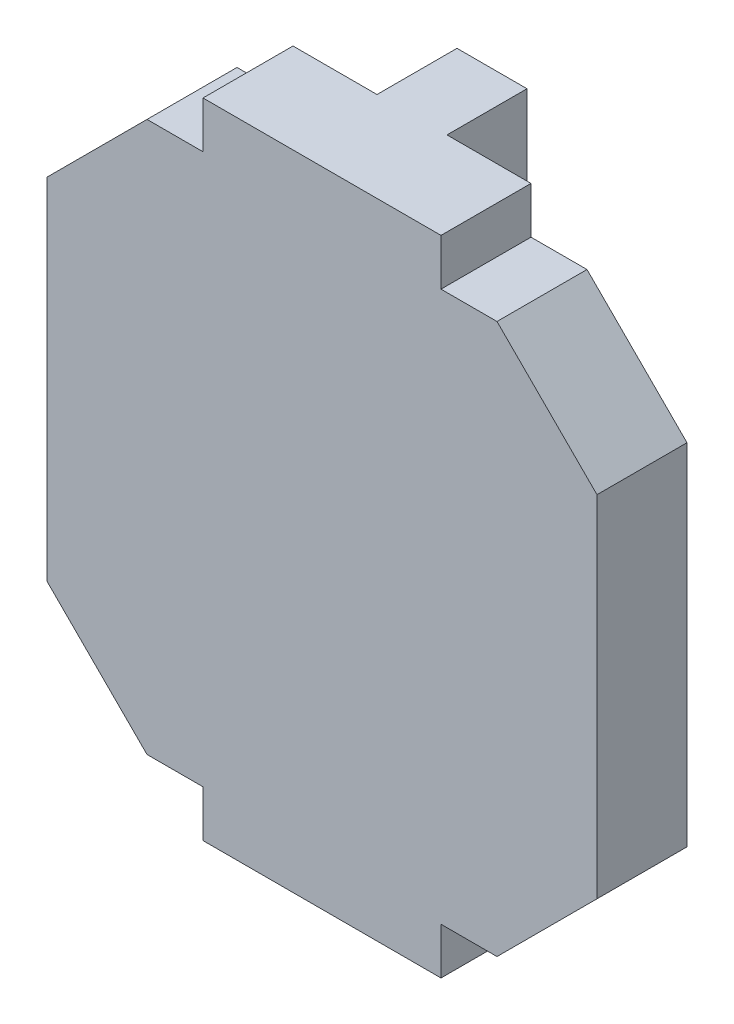
ISO-10303-21;
HEADER;
FILE_DESCRIPTION(('STEP AP214'),'2;1');
FILE_NAME('part.step','',(''),(''),'','','');
FILE_SCHEMA(('AUTOMOTIVE_DESIGN { 1 0 10303 214 1 1 1 1 }'));
ENDSEC;
DATA;
#1=APPLICATION_CONTEXT('core data for automotive mechanical design processes');
#2=APPLICATION_PROTOCOL_DEFINITION('international standard','automotive_design',2000,#1);
#3=PRODUCT_CONTEXT('',#1,'mechanical');
#4=PRODUCT('Part','Part','',(#3));
#5=PRODUCT_RELATED_PRODUCT_CATEGORY('part','',(#4));
#6=PRODUCT_DEFINITION_FORMATION('','',#4);
#7=PRODUCT_DEFINITION_CONTEXT('part definition',#1,'design');
#8=PRODUCT_DEFINITION('design','',#6,#7);
#9=PRODUCT_DEFINITION_SHAPE('','',#8);
#10=(LENGTH_UNIT() NAMED_UNIT(*) SI_UNIT(.MILLI.,.METRE.));
#11=(NAMED_UNIT(*) PLANE_ANGLE_UNIT() SI_UNIT($,.RADIAN.));
#12=(NAMED_UNIT(*) SI_UNIT($,.STERADIAN.) SOLID_ANGLE_UNIT());
#13=UNCERTAINTY_MEASURE_WITH_UNIT(LENGTH_MEASURE(1.E-05),#10,'distance_accuracy_value','');
#14=(GEOMETRIC_REPRESENTATION_CONTEXT(3) GLOBAL_UNCERTAINTY_ASSIGNED_CONTEXT((#13)) GLOBAL_UNIT_ASSIGNED_CONTEXT((#10,
#11,#12)) REPRESENTATION_CONTEXT('',''));
#15=CARTESIAN_POINT('',(0.,0.,0.));
#16=DIRECTION('',(0.,0.,1.));
#17=DIRECTION('',(1.,0.,0.));
#18=AXIS2_PLACEMENT_3D('',#15,#16,#17);
#19=CARTESIAN_POINT('',(0.,0.,0.));
#20=DIRECTION('',(0.,0.,1.));
#21=DIRECTION('',(1.,0.,0.));
#22=AXIS2_PLACEMENT_3D('',#19,#20,#21);
#23=PLANE('',#22);
#24=DIRECTION('',(-1.35982156307027E-09,1.,0.));
#25=VECTOR('',#24,1.);
#26=CARTESIAN_POINT('',(44.1324997194762,66.7580497292959,0.));
#27=LINE('',#26,#25);
#28=CARTESIAN_POINT('',(44.1324997177492,68.0280497292959,0.));
#29=VERTEX_POINT('',#28);
#30=CARTESIAN_POINT('',(44.1324997117048,72.4730496370595,0.));
#31=VERTEX_POINT('',#30);
#32=EDGE_CURVE('E268',#29,#31,#27,.T.);
#33=ORIENTED_EDGE('',*,*,#32,.F.);
#34=DIRECTION('',(0.707106780225013,0.707106782148082,0.));
#35=VECTOR('',#34,1.);
#36=CARTESIAN_POINT('',(44.1324997177492,68.0280497292959,0.));
#37=LINE('',#36,#35);
#38=CARTESIAN_POINT('',(42.8624997194762,66.7580497275689,0.));
#39=VERTEX_POINT('',#38);
#40=EDGE_CURVE('E53',#29,#39,#37,.F.);
#41=ORIENTED_EDGE('',*,*,#40,.T.);
#42=DIRECTION('',(1.,1.35982290130013E-09,0.));
#43=VECTOR('',#42,1.);
#44=CARTESIAN_POINT('',(42.1512997655944,66.7580497266018,0.));
#45=LINE('',#44,#43);
#46=CARTESIAN_POINT('',(42.1512997655944,66.7580497266018,0.));
#47=VERTEX_POINT('',#46);
#48=EDGE_CURVE('E266',#47,#39,#45,.T.);
#49=ORIENTED_EDGE('',*,*,#48,.F.);
#50=DIRECTION('',(-1.35982309308189E-09,1.,0.));
#51=VECTOR('',#50,1.);
#52=CARTESIAN_POINT('',(42.1512997663986,66.1666514845272,0.));
#53=LINE('',#52,#51);
#54=CARTESIAN_POINT('',(42.1512997663986,66.1666514845272,0.));
#55=VERTEX_POINT('',#54);
#56=EDGE_CURVE('E263',#55,#47,#53,.T.);
#57=ORIENTED_EDGE('',*,*,#56,.F.);
#58=DIRECTION('',(1.,1.35982210442275E-09,0.));
#59=VECTOR('',#58,1.);
#60=CARTESIAN_POINT('',(39.1286997663986,66.166651480417,0.));
#61=LINE('',#60,#59);
#62=CARTESIAN_POINT('',(41.0844997551882,66.1666514830765,0.));
#63=VERTEX_POINT('',#62);
#64=EDGE_CURVE('E259',#63,#55,#61,.T.);
#65=ORIENTED_EDGE('',*,*,#64,.F.);
#66=DIRECTION('',(0.,-1.,0.));
#67=VECTOR('',#66,1.);
#68=CARTESIAN_POINT('',(41.0844997551882,66.0904514817813,0.));
#69=LINE('',#68,#67);
#70=CARTESIAN_POINT('',(41.0844997551882,74.3344478749894,0.));
#71=VERTEX_POINT('',#70);
#72=EDGE_CURVE('E214',#71,#63,#69,.T.);
#73=ORIENTED_EDGE('',*,*,#72,.F.);
#74=DIRECTION('',(-1.,-1.35982210442275E-09,0.));
#75=VECTOR('',#74,1.);
#76=CARTESIAN_POINT('',(42.1512997552919,74.3344478764401,0.));
#77=LINE('',#76,#75);
#78=CARTESIAN_POINT('',(42.1512997552919,74.3344478764401,0.));
#79=VERTEX_POINT('',#78);
#80=EDGE_CURVE('E276',#79,#71,#77,.T.);
#81=ORIENTED_EDGE('',*,*,#80,.F.);
#82=DIRECTION('',(-1.35982309308183E-09,1.,0.));
#83=VECTOR('',#82,1.);
#84=CARTESIAN_POINT('',(42.1512997560961,73.7430496343654,0.));
#85=LINE('',#84,#83);
#86=CARTESIAN_POINT('',(42.1512997560961,73.7430496343654,0.));
#87=VERTEX_POINT('',#86);
#88=EDGE_CURVE('E273',#87,#79,#85,.T.);
#89=ORIENTED_EDGE('',*,*,#88,.F.);
#90=DIRECTION('',(-1.,-1.35982290130013E-09,0.));
#91=VECTOR('',#90,1.);
#92=CARTESIAN_POINT('',(44.1324997099778,73.7430496370595,0.));
#93=LINE('',#92,#91);
#94=CARTESIAN_POINT('',(42.8624997099778,73.7430496353325,0.));
#95=VERTEX_POINT('',#94);
#96=EDGE_CURVE('E271',#95,#87,#93,.T.);
#97=ORIENTED_EDGE('',*,*,#96,.F.);
#98=DIRECTION('',(-0.707106782148084,0.707106780225011,0.));
#99=VECTOR('',#98,1.);
#100=CARTESIAN_POINT('',(42.8624997099778,73.7430496353325,0.));
#101=LINE('',#100,#99);
#102=EDGE_CURVE('E61',#95,#31,#101,.F.);
#103=ORIENTED_EDGE('',*,*,#102,.T.);
#104=EDGE_LOOP('',(#33,#41,#49,#57,#65,#73,#81,#89,#97,#103));
#105=FACE_BOUND('',#104,.T.);
#106=ADVANCED_FACE('F37',(#105),#23,.F.);
#107=DIRECTION('',(1.,1.35982290130013E-09,0.));
#108=VECTOR('',#107,1.);
#109=CARTESIAN_POINT('',(37.1474998117126,66.7580497197976,0.));
#110=LINE('',#109,#108);
#111=CARTESIAN_POINT('',(38.4174998117126,66.7580497215245,0.));
#112=VERTEX_POINT('',#111);
#113=CARTESIAN_POINT('',(39.1286997655944,66.7580497224916,0.));
#114=VERTEX_POINT('',#113);
#115=EDGE_CURVE('E210',#112,#114,#110,.T.);
#116=ORIENTED_EDGE('',*,*,#115,.F.);
#117=DIRECTION('',(0.707106782148082,-0.707106780225013,0.));
#118=VECTOR('',#117,1.);
#119=CARTESIAN_POINT('',(38.4174998117126,66.7580497215245,0.));
#120=LINE('',#119,#118);
#121=CARTESIAN_POINT('',(37.1474998099856,68.0280497197976,0.));
#122=VERTEX_POINT('',#121);
#123=EDGE_CURVE('E310',#112,#122,#120,.F.);
#124=ORIENTED_EDGE('',*,*,#123,.T.);
#125=DIRECTION('',(1.35982156307027E-09,-1.,0.));
#126=VECTOR('',#125,1.);
#127=CARTESIAN_POINT('',(37.1474998022143,73.7430496275611,0.));
#128=LINE('',#127,#126);
#129=CARTESIAN_POINT('',(37.1474998039412,72.4730496275611,0.));
#130=VERTEX_POINT('',#129);
#131=EDGE_CURVE('E207',#130,#122,#128,.T.);
#132=ORIENTED_EDGE('',*,*,#131,.F.);
#133=DIRECTION('',(-0.707106780225013,-0.707106782148082,0.));
#134=VECTOR('',#133,1.);
#135=CARTESIAN_POINT('',(37.1474998039412,72.4730496275611,0.));
#136=LINE('',#135,#134);
#137=CARTESIAN_POINT('',(38.4174998022143,73.7430496292881,0.));
#138=VERTEX_POINT('',#137);
#139=EDGE_CURVE('E308',#130,#138,#136,.F.);
#140=ORIENTED_EDGE('',*,*,#139,.T.);
#141=DIRECTION('',(-1.,-1.35982290130013E-09,0.));
#142=VECTOR('',#141,1.);
#143=CARTESIAN_POINT('',(39.128699756096,73.7430496302552,0.));
#144=LINE('',#143,#142);
#145=CARTESIAN_POINT('',(39.128699756096,73.7430496302552,0.));
#146=VERTEX_POINT('',#145);
#147=EDGE_CURVE('E230',#146,#138,#144,.T.);
#148=ORIENTED_EDGE('',*,*,#147,.F.);
#149=DIRECTION('',(1.35982309308186E-09,-1.,0.));
#150=VECTOR('',#149,1.);
#151=CARTESIAN_POINT('',(39.1286997552919,74.3344478723299,0.));
#152=LINE('',#151,#150);
#153=CARTESIAN_POINT('',(39.1286997552919,74.3344478723299,0.));
#154=VERTEX_POINT('',#153);
#155=EDGE_CURVE('E278',#154,#146,#152,.T.);
#156=ORIENTED_EDGE('',*,*,#155,.F.);
#157=CARTESIAN_POINT('',(40.1954997551882,74.3344478764401,0.));
#158=VERTEX_POINT('',#157);
#159=EDGE_CURVE('E275',#158,#154,#77,.T.);
#160=ORIENTED_EDGE('',*,*,#159,.F.);
#161=DIRECTION('',(0.,1.,0.));
#162=VECTOR('',#161,1.);
#163=CARTESIAN_POINT('',(40.1954997551882,66.0904514817813,0.));
#164=LINE('',#163,#162);
#165=CARTESIAN_POINT('',(40.1954997551882,66.1666514818676,0.));
#166=VERTEX_POINT('',#165);
#167=EDGE_CURVE('E189',#166,#158,#164,.T.);
#168=ORIENTED_EDGE('',*,*,#167,.F.);
#169=CARTESIAN_POINT('',(39.1286997663986,66.166651480417,0.));
#170=VERTEX_POINT('',#169);
#171=EDGE_CURVE('E260',#170,#166,#61,.T.);
#172=ORIENTED_EDGE('',*,*,#171,.F.);
#173=DIRECTION('',(1.35982309308186E-09,-1.,0.));
#174=VECTOR('',#173,1.);
#175=CARTESIAN_POINT('',(39.1286997655944,66.7580497224916,0.));
#176=LINE('',#175,#174);
#177=EDGE_CURVE('E257',#114,#170,#176,.T.);
#178=ORIENTED_EDGE('',*,*,#177,.F.);
#179=EDGE_LOOP('',(#116,#124,#132,#140,#148,#156,#160,#168,#172,#178));
#180=FACE_BOUND('',#179,.T.);
#181=ADVANCED_FACE('F397',(#180),#23,.F.);
#182=CARTESIAN_POINT('',(37.1474998022143,73.7430496275611,1.143));
#183=DIRECTION('',(1.,1.35982156307027E-09,0.));
#184=DIRECTION('',(-1.35982156307027E-09,1.,0.));
#185=AXIS2_PLACEMENT_3D('',#182,#183,#184);
#186=PLANE('',#185);
#187=ORIENTED_EDGE('',*,*,#131,.T.);
#188=DIRECTION('',(0.,0.,1.));
#189=VECTOR('',#188,1.);
#190=CARTESIAN_POINT('',(37.1474998099856,68.0280497197976,1.143));
#191=LINE('',#190,#189);
#192=CARTESIAN_POINT('',(37.1474998099856,68.0280497197976,1.143));
#193=VERTEX_POINT('',#192);
#194=EDGE_CURVE('E315',#122,#193,#191,.T.);
#195=ORIENTED_EDGE('',*,*,#194,.T.);
#196=DIRECTION('',(1.35982156307027E-09,-1.,0.));
#197=VECTOR('',#196,1.);
#198=CARTESIAN_POINT('',(37.1474998022143,73.7430496275611,1.143));
#199=LINE('',#198,#197);
#200=CARTESIAN_POINT('',(37.1474998039412,72.4730496275611,1.143));
#201=VERTEX_POINT('',#200);
#202=EDGE_CURVE('E226',#201,#193,#199,.T.);
#203=ORIENTED_EDGE('',*,*,#202,.F.);
#204=DIRECTION('',(0.,0.,-1.));
#205=VECTOR('',#204,1.);
#206=CARTESIAN_POINT('',(37.1474998039412,72.4730496275611,1.143));
#207=LINE('',#206,#205);
#208=EDGE_CURVE('E312',#201,#130,#207,.T.);
#209=ORIENTED_EDGE('',*,*,#208,.T.);
#210=EDGE_LOOP('',(#187,#195,#203,#209));
#211=FACE_BOUND('',#210,.T.);
#212=ADVANCED_FACE('F402',(#211),#186,.F.);
#213=CARTESIAN_POINT('',(37.1474998117126,66.7580497197976,1.143));
#214=DIRECTION('',(-1.35982290130013E-09,1.,0.));
#215=DIRECTION('',(-1.,-1.35982290130013E-09,0.));
#216=AXIS2_PLACEMENT_3D('',#213,#214,#215);
#217=PLANE('',#216);
#218=DIRECTION('',(1.,1.35982290130013E-09,0.));
#219=VECTOR('',#218,1.);
#220=CARTESIAN_POINT('',(37.1474998117126,66.7580497197976,1.143));
#221=LINE('',#220,#219);
#222=CARTESIAN_POINT('',(38.4174998117126,66.7580497215245,1.143));
#223=VERTEX_POINT('',#222);
#224=CARTESIAN_POINT('',(39.1286997655944,66.7580497224916,1.143));
#225=VERTEX_POINT('',#224);
#226=EDGE_CURVE('E229',#223,#225,#221,.T.);
#227=ORIENTED_EDGE('',*,*,#226,.F.);
#228=DIRECTION('',(0.,0.,-1.));
#229=VECTOR('',#228,1.);
#230=CARTESIAN_POINT('',(38.4174998117126,66.7580497215245,1.143));
#231=LINE('',#230,#229);
#232=EDGE_CURVE('E305',#223,#112,#231,.T.);
#233=ORIENTED_EDGE('',*,*,#232,.T.);
#234=ORIENTED_EDGE('',*,*,#115,.T.);
#235=DIRECTION('',(0.,0.,-1.));
#236=VECTOR('',#235,1.);
#237=CARTESIAN_POINT('',(39.1286997655944,66.7580497224916,1.143));
#238=LINE('',#237,#236);
#239=EDGE_CURVE('E302',#225,#114,#238,.T.);
#240=ORIENTED_EDGE('',*,*,#239,.F.);
#241=EDGE_LOOP('',(#227,#233,#234,#240));
#242=FACE_BOUND('',#241,.T.);
#243=ADVANCED_FACE('F432',(#242),#217,.F.);
#244=CARTESIAN_POINT('',(39.1286997655944,66.7580497224916,1.143));
#245=DIRECTION('',(1.,1.35982309308186E-09,0.));
#246=DIRECTION('',(-1.35982309308186E-09,1.,0.));
#247=AXIS2_PLACEMENT_3D('',#244,#245,#246);
#248=PLANE('',#247);
#249=ORIENTED_EDGE('',*,*,#177,.T.);
#250=DIRECTION('',(0.,0.,-1.));
#251=VECTOR('',#250,1.);
#252=CARTESIAN_POINT('',(39.1286997663986,66.166651480417,1.143));
#253=LINE('',#252,#251);
#254=CARTESIAN_POINT('',(39.1286997663986,66.166651480417,1.143));
#255=VERTEX_POINT('',#254);
#256=EDGE_CURVE('E299',#255,#170,#253,.T.);
#257=ORIENTED_EDGE('',*,*,#256,.F.);
#258=DIRECTION('',(1.35982309308186E-09,-1.,0.));
#259=VECTOR('',#258,1.);
#260=CARTESIAN_POINT('',(39.1286997655944,66.7580497224916,1.143));
#261=LINE('',#260,#259);
#262=EDGE_CURVE('E232',#225,#255,#261,.T.);
#263=ORIENTED_EDGE('',*,*,#262,.F.);
#264=ORIENTED_EDGE('',*,*,#239,.T.);
#265=EDGE_LOOP('',(#249,#257,#263,#264));
#266=FACE_BOUND('',#265,.T.);
#267=ADVANCED_FACE('F429',(#266),#248,.F.);
#268=CARTESIAN_POINT('',(39.1286997663986,66.166651480417,1.143));
#269=DIRECTION('',(-1.35982210442275E-09,1.,0.));
#270=DIRECTION('',(-1.,-1.35982210442275E-09,0.));
#271=AXIS2_PLACEMENT_3D('',#268,#269,#270);
#272=PLANE('',#271);
#273=ORIENTED_EDGE('',*,*,#171,.T.);
#274=EDGE_CURVE('E264',#166,#63,#61,.T.);
#275=ORIENTED_EDGE('',*,*,#274,.T.);
#276=ORIENTED_EDGE('',*,*,#64,.T.);
#277=DIRECTION('',(0.,0.,-1.));
#278=VECTOR('',#277,1.);
#279=CARTESIAN_POINT('',(42.1512997663986,66.1666514845272,1.143));
#280=LINE('',#279,#278);
#281=CARTESIAN_POINT('',(42.1512997663986,66.1666514845272,1.143));
#282=VERTEX_POINT('',#281);
#283=EDGE_CURVE('E296',#282,#55,#280,.T.);
#284=ORIENTED_EDGE('',*,*,#283,.F.);
#285=DIRECTION('',(1.,1.35982210442275E-09,0.));
#286=VECTOR('',#285,1.);
#287=CARTESIAN_POINT('',(39.1286997663986,66.166651480417,1.143));
#288=LINE('',#287,#286);
#289=EDGE_CURVE('E234',#255,#282,#288,.T.);
#290=ORIENTED_EDGE('',*,*,#289,.F.);
#291=ORIENTED_EDGE('',*,*,#256,.T.);
#292=EDGE_LOOP('',(#273,#275,#276,#284,#290,#291));
#293=FACE_BOUND('',#292,.T.);
#294=ADVANCED_FACE('F375',(#293),#272,.F.);
#295=CARTESIAN_POINT('',(42.1512997663986,66.1666514845272,1.143));
#296=DIRECTION('',(-1.,-1.35982309308189E-09,0.));
#297=DIRECTION('',(1.35982309308189E-09,-1.,0.));
#298=AXIS2_PLACEMENT_3D('',#295,#296,#297);
#299=PLANE('',#298);
#300=ORIENTED_EDGE('',*,*,#56,.T.);
#301=DIRECTION('',(0.,0.,-1.));
#302=VECTOR('',#301,1.);
#303=CARTESIAN_POINT('',(42.1512997655944,66.7580497266018,1.143));
#304=LINE('',#303,#302);
#305=CARTESIAN_POINT('',(42.1512997655944,66.7580497266018,1.143));
#306=VERTEX_POINT('',#305);
#307=EDGE_CURVE('E293',#306,#47,#304,.T.);
#308=ORIENTED_EDGE('',*,*,#307,.F.);
#309=DIRECTION('',(-1.35982309308189E-09,1.,0.));
#310=VECTOR('',#309,1.);
#311=CARTESIAN_POINT('',(42.1512997663986,66.1666514845272,1.143));
#312=LINE('',#311,#310);
#313=EDGE_CURVE('E236',#282,#306,#312,.T.);
#314=ORIENTED_EDGE('',*,*,#313,.F.);
#315=ORIENTED_EDGE('',*,*,#283,.T.);
#316=EDGE_LOOP('',(#300,#308,#314,#315));
#317=FACE_BOUND('',#316,.T.);
#318=ADVANCED_FACE('F368',(#317),#299,.F.);
#319=CARTESIAN_POINT('',(42.1512997655944,66.7580497266018,1.143));
#320=DIRECTION('',(-1.35982290130013E-09,1.,0.));
#321=DIRECTION('',(-1.,-1.35982290130013E-09,0.));
#322=AXIS2_PLACEMENT_3D('',#319,#320,#321);
#323=PLANE('',#322);
#324=ORIENTED_EDGE('',*,*,#48,.T.);
#325=DIRECTION('',(0.,0.,1.));
#326=VECTOR('',#325,1.);
#327=CARTESIAN_POINT('',(42.8624997194762,66.7580497275689,1.143));
#328=LINE('',#327,#326);
#329=CARTESIAN_POINT('',(42.8624997194762,66.7580497275689,1.143));
#330=VERTEX_POINT('',#329);
#331=EDGE_CURVE('E332',#39,#330,#328,.T.);
#332=ORIENTED_EDGE('',*,*,#331,.T.);
#333=DIRECTION('',(1.,1.35982290130013E-09,0.));
#334=VECTOR('',#333,1.);
#335=CARTESIAN_POINT('',(42.1512997655944,66.7580497266018,1.143));
#336=LINE('',#335,#334);
#337=EDGE_CURVE('E238',#306,#330,#336,.T.);
#338=ORIENTED_EDGE('',*,*,#337,.F.);
#339=ORIENTED_EDGE('',*,*,#307,.T.);
#340=EDGE_LOOP('',(#324,#332,#338,#339));
#341=FACE_BOUND('',#340,.T.);
#342=ADVANCED_FACE('F362',(#341),#323,.F.);
#343=CARTESIAN_POINT('',(44.1324997194762,66.7580497292959,1.143));
#344=DIRECTION('',(-1.,-1.35982156307027E-09,0.));
#345=DIRECTION('',(1.35982156307027E-09,-1.,0.));
#346=AXIS2_PLACEMENT_3D('',#343,#344,#345);
#347=PLANE('',#346);
#348=DIRECTION('',(-1.35982156307027E-09,1.,0.));
#349=VECTOR('',#348,1.);
#350=CARTESIAN_POINT('',(44.1324997194762,66.7580497292959,1.143));
#351=LINE('',#350,#349);
#352=CARTESIAN_POINT('',(44.1324997177492,68.0280497292959,1.143));
#353=VERTEX_POINT('',#352);
#354=CARTESIAN_POINT('',(44.1324997117048,72.4730496370595,1.143));
#355=VERTEX_POINT('',#354);
#356=EDGE_CURVE('E241',#353,#355,#351,.T.);
#357=ORIENTED_EDGE('',*,*,#356,.F.);
#358=DIRECTION('',(0.,0.,-1.));
#359=VECTOR('',#358,1.);
#360=CARTESIAN_POINT('',(44.1324997177492,68.0280497292959,1.143));
#361=LINE('',#360,#359);
#362=EDGE_CURVE('E327',#353,#29,#361,.T.);
#363=ORIENTED_EDGE('',*,*,#362,.T.);
#364=ORIENTED_EDGE('',*,*,#32,.T.);
#365=DIRECTION('',(0.,0.,1.));
#366=VECTOR('',#365,1.);
#367=CARTESIAN_POINT('',(44.1324997117048,72.4730496370595,1.143));
#368=LINE('',#367,#366);
#369=EDGE_CURVE('E325',#31,#355,#368,.T.);
#370=ORIENTED_EDGE('',*,*,#369,.T.);
#371=EDGE_LOOP('',(#357,#363,#364,#370));
#372=FACE_BOUND('',#371,.T.);
#373=ADVANCED_FACE('F354',(#372),#347,.F.);
#374=CARTESIAN_POINT('',(44.1324997099778,73.7430496370595,1.143));
#375=DIRECTION('',(1.35982290130013E-09,-1.,0.));
#376=DIRECTION('',(1.,1.35982290130013E-09,0.));
#377=AXIS2_PLACEMENT_3D('',#374,#375,#376);
#378=PLANE('',#377);
#379=DIRECTION('',(-1.,-1.35982290130013E-09,0.));
#380=VECTOR('',#379,1.);
#381=CARTESIAN_POINT('',(44.1324997099778,73.7430496370595,1.143));
#382=LINE('',#381,#380);
#383=CARTESIAN_POINT('',(42.8624997099778,73.7430496353325,1.143));
#384=VERTEX_POINT('',#383);
#385=CARTESIAN_POINT('',(42.1512997560961,73.7430496343654,1.143));
#386=VERTEX_POINT('',#385);
#387=EDGE_CURVE('E244',#384,#386,#382,.T.);
#388=ORIENTED_EDGE('',*,*,#387,.F.);
#389=DIRECTION('',(0.,0.,-1.));
#390=VECTOR('',#389,1.);
#391=CARTESIAN_POINT('',(42.8624997099778,73.7430496353325,1.143));
#392=LINE('',#391,#390);
#393=EDGE_CURVE('E46',#384,#95,#392,.T.);
#394=ORIENTED_EDGE('',*,*,#393,.T.);
#395=ORIENTED_EDGE('',*,*,#96,.T.);
#396=DIRECTION('',(0.,0.,-1.));
#397=VECTOR('',#396,1.);
#398=CARTESIAN_POINT('',(42.1512997560961,73.7430496343654,1.143));
#399=LINE('',#398,#397);
#400=EDGE_CURVE('E290',#386,#87,#399,.T.);
#401=ORIENTED_EDGE('',*,*,#400,.F.);
#402=EDGE_LOOP('',(#388,#394,#395,#401));
#403=FACE_BOUND('',#402,.T.);
#404=ADVANCED_FACE('F336',(#403),#378,.F.);
#405=CARTESIAN_POINT('',(42.1512997560961,73.7430496343654,1.143));
#406=DIRECTION('',(-1.,-1.35982309308183E-09,0.));
#407=DIRECTION('',(1.35982309308183E-09,-1.,0.));
#408=AXIS2_PLACEMENT_3D('',#405,#406,#407);
#409=PLANE('',#408);
#410=ORIENTED_EDGE('',*,*,#88,.T.);
#411=DIRECTION('',(0.,0.,-1.));
#412=VECTOR('',#411,1.);
#413=CARTESIAN_POINT('',(42.1512997552919,74.3344478764401,1.143));
#414=LINE('',#413,#412);
#415=CARTESIAN_POINT('',(42.1512997552919,74.3344478764401,1.143));
#416=VERTEX_POINT('',#415);
#417=EDGE_CURVE('E287',#416,#79,#414,.T.);
#418=ORIENTED_EDGE('',*,*,#417,.F.);
#419=DIRECTION('',(-1.35982309308183E-09,1.,0.));
#420=VECTOR('',#419,1.);
#421=CARTESIAN_POINT('',(42.1512997560961,73.7430496343654,1.143));
#422=LINE('',#421,#420);
#423=EDGE_CURVE('E246',#386,#416,#422,.T.);
#424=ORIENTED_EDGE('',*,*,#423,.F.);
#425=ORIENTED_EDGE('',*,*,#400,.T.);
#426=EDGE_LOOP('',(#410,#418,#424,#425));
#427=FACE_BOUND('',#426,.T.);
#428=ADVANCED_FACE('F343',(#427),#409,.F.);
#429=CARTESIAN_POINT('',(42.1512997552919,74.3344478764401,1.143));
#430=DIRECTION('',(1.35982210442275E-09,-1.,0.));
#431=DIRECTION('',(1.,1.35982210442275E-09,0.));
#432=AXIS2_PLACEMENT_3D('',#429,#430,#431);
#433=PLANE('',#432);
#434=ORIENTED_EDGE('',*,*,#80,.T.);
#435=DIRECTION('',(0.,0.,1.));
#436=VECTOR('',#435,1.);
#437=CARTESIAN_POINT('',(41.0844997551882,74.3344478764401,-9.30779097391792));
#438=LINE('',#437,#436);
#439=CARTESIAN_POINT('',(41.0844997551882,74.3344478764401,-1.016));
#440=VERTEX_POINT('',#439);
#441=EDGE_CURVE('E198',#440,#71,#438,.T.);
#442=ORIENTED_EDGE('',*,*,#441,.F.);
#443=DIRECTION('',(1.,0.,0.));
#444=VECTOR('',#443,1.);
#445=CARTESIAN_POINT('',(40.1954997551882,74.3344478764401,-1.016));
#446=LINE('',#445,#444);
#447=CARTESIAN_POINT('',(40.1954997551882,74.3344478764401,-1.016));
#448=VERTEX_POINT('',#447);
#449=EDGE_CURVE('E191',#448,#440,#446,.T.);
#450=ORIENTED_EDGE('',*,*,#449,.F.);
#451=DIRECTION('',(0.,0.,1.));
#452=VECTOR('',#451,1.);
#453=CARTESIAN_POINT('',(40.1954997551882,74.3344478764401,-9.30779097391792));
#454=LINE('',#453,#452);
#455=EDGE_CURVE('E182',#448,#158,#454,.T.);
#456=ORIENTED_EDGE('',*,*,#455,.T.);
#457=ORIENTED_EDGE('',*,*,#159,.T.);
#458=DIRECTION('',(0.,0.,-1.));
#459=VECTOR('',#458,1.);
#460=CARTESIAN_POINT('',(39.1286997552919,74.3344478723299,1.143));
#461=LINE('',#460,#459);
#462=CARTESIAN_POINT('',(39.1286997552919,74.3344478723299,1.143));
#463=VERTEX_POINT('',#462);
#464=EDGE_CURVE('E284',#463,#154,#461,.T.);
#465=ORIENTED_EDGE('',*,*,#464,.F.);
#466=DIRECTION('',(-1.,-1.35982210442275E-09,0.));
#467=VECTOR('',#466,1.);
#468=CARTESIAN_POINT('',(42.1512997552919,74.3344478764401,1.143));
#469=LINE('',#468,#467);
#470=EDGE_CURVE('E248',#416,#463,#469,.T.);
#471=ORIENTED_EDGE('',*,*,#470,.F.);
#472=ORIENTED_EDGE('',*,*,#417,.T.);
#473=EDGE_LOOP('',(#434,#442,#450,#456,#457,#465,#471,#472));
#474=FACE_BOUND('',#473,.T.);
#475=ADVANCED_FACE('F196',(#474),#433,.F.);
#476=CARTESIAN_POINT('',(39.1286997552919,74.3344478723299,1.143));
#477=DIRECTION('',(1.,1.35982309308186E-09,0.));
#478=DIRECTION('',(-1.35982309308186E-09,1.,0.));
#479=AXIS2_PLACEMENT_3D('',#476,#477,#478);
#480=PLANE('',#479);
#481=ORIENTED_EDGE('',*,*,#155,.T.);
#482=DIRECTION('',(0.,0.,-1.));
#483=VECTOR('',#482,1.);
#484=CARTESIAN_POINT('',(39.128699756096,73.7430496302552,1.143));
#485=LINE('',#484,#483);
#486=CARTESIAN_POINT('',(39.128699756096,73.7430496302552,1.143));
#487=VERTEX_POINT('',#486);
#488=EDGE_CURVE('E254',#487,#146,#485,.T.);
#489=ORIENTED_EDGE('',*,*,#488,.F.);
#490=DIRECTION('',(1.35982309308186E-09,-1.,0.));
#491=VECTOR('',#490,1.);
#492=CARTESIAN_POINT('',(39.1286997552919,74.3344478723299,1.143));
#493=LINE('',#492,#491);
#494=EDGE_CURVE('E250',#463,#487,#493,.T.);
#495=ORIENTED_EDGE('',*,*,#494,.F.);
#496=ORIENTED_EDGE('',*,*,#464,.T.);
#497=EDGE_LOOP('',(#481,#489,#495,#496));
#498=FACE_BOUND('',#497,.T.);
#499=ADVANCED_FACE('F410',(#498),#480,.F.);
#500=CARTESIAN_POINT('',(39.128699756096,73.7430496302552,1.143));
#501=DIRECTION('',(1.35982290130013E-09,-1.,0.));
#502=DIRECTION('',(1.,1.35982290130013E-09,0.));
#503=AXIS2_PLACEMENT_3D('',#500,#501,#502);
#504=PLANE('',#503);
#505=ORIENTED_EDGE('',*,*,#147,.T.);
#506=DIRECTION('',(0.,0.,1.));
#507=VECTOR('',#506,1.);
#508=CARTESIAN_POINT('',(38.4174998022143,73.7430496292881,1.143));
#509=LINE('',#508,#507);
#510=CARTESIAN_POINT('',(38.4174998022143,73.7430496292881,1.143));
#511=VERTEX_POINT('',#510);
#512=EDGE_CURVE('E11',#138,#511,#509,.T.);
#513=ORIENTED_EDGE('',*,*,#512,.T.);
#514=DIRECTION('',(-1.,-1.35982290130013E-09,0.));
#515=VECTOR('',#514,1.);
#516=CARTESIAN_POINT('',(39.128699756096,73.7430496302552,1.143));
#517=LINE('',#516,#515);
#518=EDGE_CURVE('E252',#487,#511,#517,.T.);
#519=ORIENTED_EDGE('',*,*,#518,.F.);
#520=ORIENTED_EDGE('',*,*,#488,.T.);
#521=EDGE_LOOP('',(#505,#513,#519,#520));
#522=FACE_BOUND('',#521,.T.);
#523=ADVANCED_FACE('F407',(#522),#504,.F.);
#524=CARTESIAN_POINT('',(0.,0.,1.143));
#525=DIRECTION('',(0.,0.,1.));
#526=DIRECTION('',(1.,0.,0.));
#527=AXIS2_PLACEMENT_3D('',#524,#525,#526);
#528=PLANE('',#527);
#529=ORIENTED_EDGE('',*,*,#202,.T.);
#530=DIRECTION('',(-0.707106782148082,0.707106780225013,0.));
#531=VECTOR('',#530,1.);
#532=CARTESIAN_POINT('',(52.5877747143778,52.5877748573972,1.143));
#533=LINE('',#532,#531);
#534=EDGE_CURVE('E323',#193,#223,#533,.F.);
#535=ORIENTED_EDGE('',*,*,#534,.T.);
#536=ORIENTED_EDGE('',*,*,#226,.T.);
#537=ORIENTED_EDGE('',*,*,#262,.T.);
#538=ORIENTED_EDGE('',*,*,#289,.T.);
#539=ORIENTED_EDGE('',*,*,#313,.T.);
#540=ORIENTED_EDGE('',*,*,#337,.T.);
#541=DIRECTION('',(-0.707106780225013,-0.707106782148082,0.));
#542=VECTOR('',#541,1.);
#543=CARTESIAN_POINT('',(-11.9477749457613,11.9477749132677,1.143));
#544=LINE('',#543,#542);
#545=EDGE_CURVE('E321',#330,#353,#544,.F.);
#546=ORIENTED_EDGE('',*,*,#545,.T.);
#547=ORIENTED_EDGE('',*,*,#356,.T.);
#548=DIRECTION('',(0.707106782148084,-0.707106780225011,0.));
#549=VECTOR('',#548,1.);
#550=CARTESIAN_POINT('',(58.30277461437,58.3027747729323,1.143));
#551=LINE('',#550,#549);
#552=EDGE_CURVE('E319',#355,#384,#551,.F.);
#553=ORIENTED_EDGE('',*,*,#552,.T.);
#554=ORIENTED_EDGE('',*,*,#387,.T.);
#555=ORIENTED_EDGE('',*,*,#423,.T.);
#556=ORIENTED_EDGE('',*,*,#470,.T.);
#557=ORIENTED_EDGE('',*,*,#494,.T.);
#558=ORIENTED_EDGE('',*,*,#518,.T.);
#559=DIRECTION('',(0.707106780225013,0.707106782148082,0.));
#560=VECTOR('',#559,1.);
#561=CARTESIAN_POINT('',(-17.6627748612962,17.66277481326,1.143));
#562=LINE('',#561,#560);
#563=EDGE_CURVE('E317',#511,#201,#562,.F.);
#564=ORIENTED_EDGE('',*,*,#563,.T.);
#565=EDGE_LOOP('',(#529,#535,#536,#537,#538,#539,#540,#546,#547,#553,#554,#555,#556,#557,#558,#564));
#566=FACE_BOUND('',#565,.T.);
#567=ADVANCED_FACE('F349',(#566),#528,.T.);
#568=CARTESIAN_POINT('',(41.0844997551882,66.0904514817813,-9.30779097391792));
#569=DIRECTION('',(-1.,0.,0.));
#570=DIRECTION('',(0.,0.,1.));
#571=AXIS2_PLACEMENT_3D('',#568,#569,#570);
#572=PLANE('',#571);
#573=DIRECTION('',(0.,-1.,0.));
#574=VECTOR('',#573,1.);
#575=CARTESIAN_POINT('',(41.0844997551882,66.0904514817813,-1.016));
#576=LINE('',#575,#574);
#577=CARTESIAN_POINT('',(41.0844997551882,66.0904514817813,-1.016));
#578=VERTEX_POINT('',#577);
#579=EDGE_CURVE('E202',#440,#578,#576,.T.);
#580=ORIENTED_EDGE('',*,*,#579,.F.);
#581=ORIENTED_EDGE('',*,*,#441,.T.);
#582=ORIENTED_EDGE('',*,*,#72,.T.);
#583=CARTESIAN_POINT('',(41.0844997551882,66.0904514817813,0.));
#584=VERTEX_POINT('',#583);
#585=EDGE_CURVE('E225',#63,#584,#69,.T.);
#586=ORIENTED_EDGE('',*,*,#585,.T.);
#587=DIRECTION('',(0.,0.,1.));
#588=VECTOR('',#587,1.);
#589=CARTESIAN_POINT('',(41.0844997551882,66.0904514817813,-9.30779097391792));
#590=LINE('',#589,#588);
#591=EDGE_CURVE('E218',#578,#584,#590,.T.);
#592=ORIENTED_EDGE('',*,*,#591,.F.);
#593=EDGE_LOOP('',(#580,#581,#582,#586,#592));
#594=FACE_BOUND('',#593,.T.);
#595=ADVANCED_FACE('F384',(#594),#572,.F.);
#596=CARTESIAN_POINT('',(40.1954997551882,66.0904514817813,-9.30779097391792));
#597=DIRECTION('',(0.,1.,0.));
#598=DIRECTION('',(0.,0.,1.));
#599=AXIS2_PLACEMENT_3D('',#596,#597,#598);
#600=PLANE('',#599);
#601=DIRECTION('',(-1.,0.,0.));
#602=VECTOR('',#601,1.);
#603=CARTESIAN_POINT('',(40.1954997551882,66.0904514817813,-1.016));
#604=LINE('',#603,#602);
#605=CARTESIAN_POINT('',(40.1954997551882,66.0904514817813,-1.016));
#606=VERTEX_POINT('',#605);
#607=EDGE_CURVE('E206',#578,#606,#604,.T.);
#608=ORIENTED_EDGE('',*,*,#607,.F.);
#609=ORIENTED_EDGE('',*,*,#591,.T.);
#610=DIRECTION('',(-1.,0.,0.));
#611=VECTOR('',#610,1.);
#612=CARTESIAN_POINT('',(40.1954997551882,66.0904514817813,0.));
#613=LINE('',#612,#611);
#614=CARTESIAN_POINT('',(40.1954997551882,66.0904514817813,0.));
#615=VERTEX_POINT('',#614);
#616=EDGE_CURVE('E221',#584,#615,#613,.T.);
#617=ORIENTED_EDGE('',*,*,#616,.T.);
#618=DIRECTION('',(0.,0.,1.));
#619=VECTOR('',#618,1.);
#620=CARTESIAN_POINT('',(40.1954997551882,66.0904514817813,-9.30779097391792));
#621=LINE('',#620,#619);
#622=EDGE_CURVE('E222',#606,#615,#621,.T.);
#623=ORIENTED_EDGE('',*,*,#622,.F.);
#624=EDGE_LOOP('',(#608,#609,#617,#623));
#625=FACE_BOUND('',#624,.T.);
#626=ADVANCED_FACE('F386',(#625),#600,.F.);
#627=CARTESIAN_POINT('',(40.1954997551882,66.0904514817813,-9.30779097391792));
#628=DIRECTION('',(1.,0.,0.));
#629=DIRECTION('',(0.,0.,-1.));
#630=AXIS2_PLACEMENT_3D('',#627,#628,#629);
#631=PLANE('',#630);
#632=DIRECTION('',(0.,1.,0.));
#633=VECTOR('',#632,1.);
#634=CARTESIAN_POINT('',(40.1954997551882,66.0904514817813,-1.016));
#635=LINE('',#634,#633);
#636=EDGE_CURVE('E186',#606,#448,#635,.T.);
#637=ORIENTED_EDGE('',*,*,#636,.F.);
#638=ORIENTED_EDGE('',*,*,#622,.T.);
#639=EDGE_CURVE('E192',#615,#166,#164,.T.);
#640=ORIENTED_EDGE('',*,*,#639,.T.);
#641=ORIENTED_EDGE('',*,*,#167,.T.);
#642=ORIENTED_EDGE('',*,*,#455,.F.);
#643=EDGE_LOOP('',(#637,#638,#640,#641,#642));
#644=FACE_BOUND('',#643,.T.);
#645=ADVANCED_FACE('F184',(#644),#631,.F.);
#646=CARTESIAN_POINT('',(0.,0.,0.));
#647=DIRECTION('',(0.,0.,-1.));
#648=DIRECTION('',(-1.,0.,0.));
#649=AXIS2_PLACEMENT_3D('',#646,#647,#648);
#650=PLANE('',#649);
#651=ORIENTED_EDGE('',*,*,#274,.F.);
#652=ORIENTED_EDGE('',*,*,#639,.F.);
#653=ORIENTED_EDGE('',*,*,#616,.F.);
#654=ORIENTED_EDGE('',*,*,#585,.F.);
#655=EDGE_LOOP('',(#651,#652,#653,#654));
#656=FACE_BOUND('',#655,.T.);
#657=ADVANCED_FACE('F380',(#656),#650,.F.);
#658=CARTESIAN_POINT('',(40.6399997608452,70.2505496784285,-1.016));
#659=DIRECTION('',(0.,0.,-1.));
#660=DIRECTION('',(1.,1.35982227132282E-09,0.));
#661=AXIS2_PLACEMENT_3D('',#658,#659,#660);
#662=PLANE('',#661);
#663=ORIENTED_EDGE('',*,*,#449,.T.);
#664=ORIENTED_EDGE('',*,*,#579,.T.);
#665=ORIENTED_EDGE('',*,*,#607,.T.);
#666=ORIENTED_EDGE('',*,*,#636,.T.);
#667=EDGE_LOOP('',(#663,#664,#665,#666));
#668=FACE_BOUND('',#667,.T.);
#669=ADVANCED_FACE('F205',(#668),#662,.T.);
#670=CARTESIAN_POINT('',(38.4174998117126,66.7580497215245,1.143));
#671=DIRECTION('',(0.707106780225013,0.707106782148082,0.));
#672=DIRECTION('',(0.,0.,-1.));
#673=AXIS2_PLACEMENT_3D('',#670,#671,#672);
#674=PLANE('',#673);
#675=ORIENTED_EDGE('',*,*,#534,.F.);
#676=ORIENTED_EDGE('',*,*,#194,.F.);
#677=ORIENTED_EDGE('',*,*,#123,.F.);
#678=ORIENTED_EDGE('',*,*,#232,.F.);
#679=EDGE_LOOP('',(#675,#676,#677,#678));
#680=FACE_BOUND('',#679,.T.);
#681=ADVANCED_FACE('F441',(#680),#674,.F.);
#682=CARTESIAN_POINT('',(44.1324997177492,68.0280497292959,1.143));
#683=DIRECTION('',(-0.707106782148082,0.707106780225013,0.));
#684=DIRECTION('',(0.,0.,-1.));
#685=AXIS2_PLACEMENT_3D('',#682,#683,#684);
#686=PLANE('',#685);
#687=ORIENTED_EDGE('',*,*,#545,.F.);
#688=ORIENTED_EDGE('',*,*,#331,.F.);
#689=ORIENTED_EDGE('',*,*,#40,.F.);
#690=ORIENTED_EDGE('',*,*,#362,.F.);
#691=EDGE_LOOP('',(#687,#688,#689,#690));
#692=FACE_BOUND('',#691,.T.);
#693=ADVANCED_FACE('F358',(#692),#686,.F.);
#694=CARTESIAN_POINT('',(42.8624997099778,73.7430496353325,1.143));
#695=DIRECTION('',(-0.707106780225011,-0.707106782148084,0.));
#696=DIRECTION('',(0.,0.,-1.));
#697=AXIS2_PLACEMENT_3D('',#694,#695,#696);
#698=PLANE('',#697);
#699=ORIENTED_EDGE('',*,*,#552,.F.);
#700=ORIENTED_EDGE('',*,*,#369,.F.);
#701=ORIENTED_EDGE('',*,*,#102,.F.);
#702=ORIENTED_EDGE('',*,*,#393,.F.);
#703=EDGE_LOOP('',(#699,#700,#701,#702));
#704=FACE_BOUND('',#703,.T.);
#705=ADVANCED_FACE('F352',(#704),#698,.F.);
#706=CARTESIAN_POINT('',(37.1474998039412,72.4730496275611,1.143));
#707=DIRECTION('',(0.707106782148082,-0.707106780225013,0.));
#708=DIRECTION('',(0.,0.,-1.));
#709=AXIS2_PLACEMENT_3D('',#706,#707,#708);
#710=PLANE('',#709);
#711=ORIENTED_EDGE('',*,*,#563,.F.);
#712=ORIENTED_EDGE('',*,*,#512,.F.);
#713=ORIENTED_EDGE('',*,*,#139,.F.);
#714=ORIENTED_EDGE('',*,*,#208,.F.);
#715=EDGE_LOOP('',(#711,#712,#713,#714));
#716=FACE_BOUND('',#715,.T.);
#717=ADVANCED_FACE('F40',(#716),#710,.F.);
#718=CLOSED_SHELL('',(#106,#181,#212,#243,#267,#294,#318,#342,#373,#404,#428,#475,#499,#523,
#567,#595,#626,#645,#657,#669,#681,#693,#705,#717));
#719=MANIFOLD_SOLID_BREP('B2',#718);
#720=ADVANCED_BREP_SHAPE_REPRESENTATION('',(#18,#719),#14);
#721=SHAPE_DEFINITION_REPRESENTATION(#9,#720);
ENDSEC;
END-ISO-10303-21;
